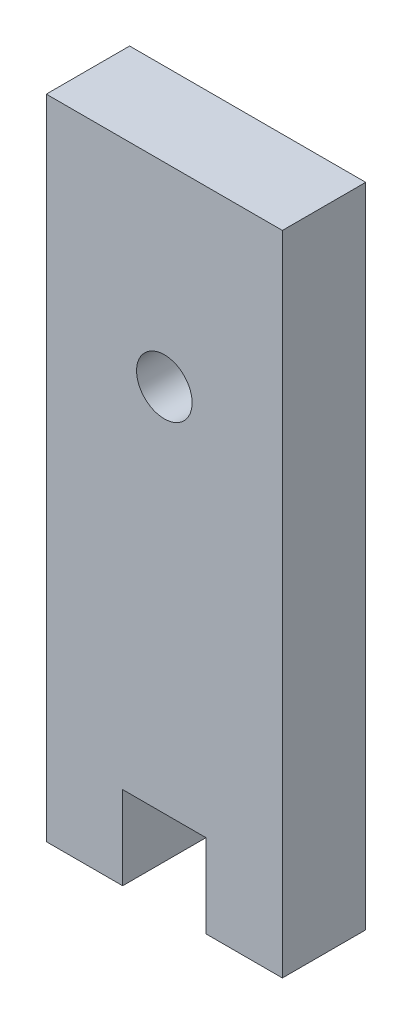
ISO-10303-21;
HEADER;
FILE_DESCRIPTION(('STEP AP214'),'2;1');
FILE_NAME('part.step','',(''),(''),'','','');
FILE_SCHEMA(('AUTOMOTIVE_DESIGN { 1 0 10303 214 1 1 1 1 }'));
ENDSEC;
DATA;
#1=APPLICATION_CONTEXT('core data for automotive mechanical design processes');
#2=APPLICATION_PROTOCOL_DEFINITION('international standard','automotive_design',2000,#1);
#3=PRODUCT_CONTEXT('',#1,'mechanical');
#4=PRODUCT('Part','Part','',(#3));
#5=PRODUCT_RELATED_PRODUCT_CATEGORY('part','',(#4));
#6=PRODUCT_DEFINITION_FORMATION('','',#4);
#7=PRODUCT_DEFINITION_CONTEXT('part definition',#1,'design');
#8=PRODUCT_DEFINITION('design','',#6,#7);
#9=PRODUCT_DEFINITION_SHAPE('','',#8);
#10=(LENGTH_UNIT() NAMED_UNIT(*) SI_UNIT(.MILLI.,.METRE.));
#11=(NAMED_UNIT(*) PLANE_ANGLE_UNIT() SI_UNIT($,.RADIAN.));
#12=(NAMED_UNIT(*) SI_UNIT($,.STERADIAN.) SOLID_ANGLE_UNIT());
#13=UNCERTAINTY_MEASURE_WITH_UNIT(LENGTH_MEASURE(1.E-05),#10,'distance_accuracy_value','');
#14=(GEOMETRIC_REPRESENTATION_CONTEXT(3) GLOBAL_UNCERTAINTY_ASSIGNED_CONTEXT((#13)) GLOBAL_UNIT_ASSIGNED_CONTEXT((#10,
#11,#12)) REPRESENTATION_CONTEXT('',''));
#15=CARTESIAN_POINT('',(0.,0.,0.));
#16=DIRECTION('',(0.,0.,1.));
#17=DIRECTION('',(1.,0.,0.));
#18=AXIS2_PLACEMENT_3D('',#15,#16,#17);
#19=CARTESIAN_POINT('',(0.,0.,3.));
#20=DIRECTION('',(0.,0.,-1.));
#21=DIRECTION('',(-1.,0.,0.));
#22=AXIS2_PLACEMENT_3D('',#19,#20,#21);
#23=PLANE('',#22);
#24=DIRECTION('',(0.,1.,0.));
#25=VECTOR('',#24,1.);
#26=CARTESIAN_POINT('',(6.07144018702043,-7.25278388972828,3.));
#27=LINE('',#26,#25);
#28=CARTESIAN_POINT('',(6.07144018702043,-10.2527838897283,3.));
#29=VERTEX_POINT('',#28);
#30=CARTESIAN_POINT('',(6.07144018702043,13.0563159058902,3.));
#31=VERTEX_POINT('',#30);
#32=EDGE_CURVE('E57',#29,#31,#27,.T.);
#33=ORIENTED_EDGE('',*,*,#32,.T.);
#34=DIRECTION('',(-1.,0.,0.));
#35=VECTOR('',#34,1.);
#36=CARTESIAN_POINT('',(-2.42855981297957,13.0563159058902,3.));
#37=LINE('',#36,#35);
#38=CARTESIAN_POINT('',(-2.42855981297957,13.0563159058902,3.));
#39=VERTEX_POINT('',#38);
#40=EDGE_CURVE('E101',#31,#39,#37,.T.);
#41=ORIENTED_EDGE('',*,*,#40,.T.);
#42=DIRECTION('',(0.,-1.,0.));
#43=VECTOR('',#42,1.);
#44=CARTESIAN_POINT('',(-2.42855981297957,-7.44368409410983,3.));
#45=LINE('',#44,#43);
#46=CARTESIAN_POINT('',(-2.42855981297957,-10.2527838897283,3.));
#47=VERTEX_POINT('',#46);
#48=EDGE_CURVE('E187',#39,#47,#45,.T.);
#49=ORIENTED_EDGE('',*,*,#48,.T.);
#50=DIRECTION('',(1.,0.,0.));
#51=VECTOR('',#50,1.);
#52=CARTESIAN_POINT('',(-2.42855981297957,-10.2527838897283,3.));
#53=LINE('',#52,#51);
#54=CARTESIAN_POINT('',(0.321440187020429,-10.2527838897283,3.));
#55=VERTEX_POINT('',#54);
#56=EDGE_CURVE('E202',#47,#55,#53,.T.);
#57=ORIENTED_EDGE('',*,*,#56,.T.);
#58=DIRECTION('',(0.,1.,0.));
#59=VECTOR('',#58,1.);
#60=CARTESIAN_POINT('',(0.321440187020429,-10.2527838897283,3.));
#61=LINE('',#60,#59);
#62=CARTESIAN_POINT('',(0.321440187020429,-7.25278388972828,3.));
#63=VERTEX_POINT('',#62);
#64=EDGE_CURVE('E121',#55,#63,#61,.T.);
#65=ORIENTED_EDGE('',*,*,#64,.T.);
#66=DIRECTION('',(1.,0.,0.));
#67=VECTOR('',#66,1.);
#68=CARTESIAN_POINT('',(0.321440187020429,-7.25278388972828,3.));
#69=LINE('',#68,#67);
#70=CARTESIAN_POINT('',(3.32144018702043,-7.25278388972828,3.));
#71=VERTEX_POINT('',#70);
#72=EDGE_CURVE('E115',#63,#71,#69,.T.);
#73=ORIENTED_EDGE('',*,*,#72,.T.);
#74=DIRECTION('',(0.,-1.,0.));
#75=VECTOR('',#74,1.);
#76=CARTESIAN_POINT('',(3.32144018702043,-10.2527838897283,3.));
#77=LINE('',#76,#75);
#78=CARTESIAN_POINT('',(3.32144018702043,-10.2527838897283,3.));
#79=VERTEX_POINT('',#78);
#80=EDGE_CURVE('E119',#71,#79,#77,.T.);
#81=ORIENTED_EDGE('',*,*,#80,.T.);
#82=DIRECTION('',(1.,0.,0.));
#83=VECTOR('',#82,1.);
#84=CARTESIAN_POINT('',(3.32144018702043,-10.2527838897283,3.));
#85=LINE('',#84,#83);
#86=EDGE_CURVE('E138',#79,#29,#85,.T.);
#87=ORIENTED_EDGE('',*,*,#86,.T.);
#88=EDGE_LOOP('',(#33,#41,#49,#57,#65,#73,#81,#87));
#89=FACE_BOUND('',#88,.T.);
#90=CARTESIAN_POINT('',(1.82144018702043,6.05631590589017,3.));
#91=DIRECTION('',(0.,0.,1.));
#92=DIRECTION('',(1.,0.,0.));
#93=AXIS2_PLACEMENT_3D('',#90,#91,#92);
#94=CIRCLE('',#93,1.);
#95=CARTESIAN_POINT('',(2.82144018702043,6.05631590589017,3.));
#96=VERTEX_POINT('',#95);
#97=EDGE_CURVE('E150',#96,#96,#94,.T.);
#98=ORIENTED_EDGE('',*,*,#97,.F.);
#99=EDGE_LOOP('',(#98));
#100=FACE_BOUND('',#99,.T.);
#101=ADVANCED_FACE('F39',(#89,#100),#23,.F.);
#102=CARTESIAN_POINT('',(0.,0.,0.));
#103=DIRECTION('',(0.,0.,-1.));
#104=DIRECTION('',(-1.,0.,0.));
#105=AXIS2_PLACEMENT_3D('',#102,#103,#104);
#106=PLANE('',#105);
#107=DIRECTION('',(-1.,0.,0.));
#108=VECTOR('',#107,1.);
#109=CARTESIAN_POINT('',(-2.42855981297957,13.0563159058902,0.));
#110=LINE('',#109,#108);
#111=CARTESIAN_POINT('',(6.07144018702043,13.0563159058902,0.));
#112=VERTEX_POINT('',#111);
#113=CARTESIAN_POINT('',(-2.42855981297957,13.0563159058902,0.));
#114=VERTEX_POINT('',#113);
#115=EDGE_CURVE('E145',#112,#114,#110,.T.);
#116=ORIENTED_EDGE('',*,*,#115,.F.);
#117=DIRECTION('',(0.,1.,0.));
#118=VECTOR('',#117,1.);
#119=CARTESIAN_POINT('',(6.07144018702043,-7.25278388972828,0.));
#120=LINE('',#119,#118);
#121=CARTESIAN_POINT('',(6.07144018702043,-10.2527838897283,0.));
#122=VERTEX_POINT('',#121);
#123=EDGE_CURVE('E165',#122,#112,#120,.T.);
#124=ORIENTED_EDGE('',*,*,#123,.F.);
#125=DIRECTION('',(1.,0.,0.));
#126=VECTOR('',#125,1.);
#127=CARTESIAN_POINT('',(3.32144018702043,-10.2527838897283,0.));
#128=LINE('',#127,#126);
#129=CARTESIAN_POINT('',(3.32144018702043,-10.2527838897283,0.));
#130=VERTEX_POINT('',#129);
#131=EDGE_CURVE('E94',#130,#122,#128,.T.);
#132=ORIENTED_EDGE('',*,*,#131,.F.);
#133=DIRECTION('',(0.,-1.,0.));
#134=VECTOR('',#133,1.);
#135=CARTESIAN_POINT('',(3.32144018702043,-10.2527838897283,0.));
#136=LINE('',#135,#134);
#137=CARTESIAN_POINT('',(3.32144018702043,-7.25278388972828,0.));
#138=VERTEX_POINT('',#137);
#139=EDGE_CURVE('E87',#138,#130,#136,.T.);
#140=ORIENTED_EDGE('',*,*,#139,.F.);
#141=DIRECTION('',(1.,0.,0.));
#142=VECTOR('',#141,1.);
#143=CARTESIAN_POINT('',(0.321440187020429,-7.25278388972828,0.));
#144=LINE('',#143,#142);
#145=CARTESIAN_POINT('',(0.321440187020429,-7.25278388972828,0.));
#146=VERTEX_POINT('',#145);
#147=EDGE_CURVE('E130',#146,#138,#144,.T.);
#148=ORIENTED_EDGE('',*,*,#147,.F.);
#149=DIRECTION('',(0.,1.,0.));
#150=VECTOR('',#149,1.);
#151=CARTESIAN_POINT('',(0.321440187020429,-10.2527838897283,0.));
#152=LINE('',#151,#150);
#153=CARTESIAN_POINT('',(0.321440187020429,-10.2527838897283,0.));
#154=VERTEX_POINT('',#153);
#155=EDGE_CURVE('E156',#154,#146,#152,.T.);
#156=ORIENTED_EDGE('',*,*,#155,.F.);
#157=DIRECTION('',(1.,0.,0.));
#158=VECTOR('',#157,1.);
#159=CARTESIAN_POINT('',(-2.42855981297957,-10.2527838897283,0.));
#160=LINE('',#159,#158);
#161=CARTESIAN_POINT('',(-2.42855981297957,-10.2527838897283,0.));
#162=VERTEX_POINT('',#161);
#163=EDGE_CURVE('E153',#162,#154,#160,.T.);
#164=ORIENTED_EDGE('',*,*,#163,.F.);
#165=DIRECTION('',(0.,-1.,0.));
#166=VECTOR('',#165,1.);
#167=CARTESIAN_POINT('',(-2.42855981297957,-7.44368409410983,0.));
#168=LINE('',#167,#166);
#169=EDGE_CURVE('E149',#114,#162,#168,.T.);
#170=ORIENTED_EDGE('',*,*,#169,.F.);
#171=EDGE_LOOP('',(#116,#124,#132,#140,#148,#156,#164,#170));
#172=FACE_BOUND('',#171,.T.);
#173=CARTESIAN_POINT('',(1.82144018702043,6.05631590589017,0.));
#174=DIRECTION('',(0.,0.,1.));
#175=DIRECTION('',(1.,0.,0.));
#176=AXIS2_PLACEMENT_3D('',#173,#174,#175);
#177=CIRCLE('',#176,1.);
#178=CARTESIAN_POINT('',(2.82144018702043,6.05631590589017,0.));
#179=VERTEX_POINT('',#178);
#180=EDGE_CURVE('E212',#179,#179,#177,.T.);
#181=ORIENTED_EDGE('',*,*,#180,.T.);
#182=EDGE_LOOP('',(#181));
#183=FACE_BOUND('',#182,.T.);
#184=ADVANCED_FACE('F191',(#172,#183),#106,.T.);
#185=CARTESIAN_POINT('',(-2.42855981297957,13.0563159058902,3.));
#186=DIRECTION('',(0.,-1.,0.));
#187=DIRECTION('',(0.,0.,-1.));
#188=AXIS2_PLACEMENT_3D('',#185,#186,#187);
#189=PLANE('',#188);
#190=ORIENTED_EDGE('',*,*,#115,.T.);
#191=DIRECTION('',(0.,0.,-1.));
#192=VECTOR('',#191,1.);
#193=CARTESIAN_POINT('',(-2.42855981297957,13.0563159058902,3.));
#194=LINE('',#193,#192);
#195=EDGE_CURVE('E49',#39,#114,#194,.T.);
#196=ORIENTED_EDGE('',*,*,#195,.F.);
#197=ORIENTED_EDGE('',*,*,#40,.F.);
#198=DIRECTION('',(0.,0.,-1.));
#199=VECTOR('',#198,1.);
#200=CARTESIAN_POINT('',(6.07144018702043,13.0563159058902,3.));
#201=LINE('',#200,#199);
#202=EDGE_CURVE('E11',#31,#112,#201,.T.);
#203=ORIENTED_EDGE('',*,*,#202,.T.);
#204=EDGE_LOOP('',(#190,#196,#197,#203));
#205=FACE_BOUND('',#204,.T.);
#206=ADVANCED_FACE('F41',(#205),#189,.F.);
#207=CARTESIAN_POINT('',(-2.42855981297957,-7.44368409410983,3.));
#208=DIRECTION('',(1.,0.,0.));
#209=DIRECTION('',(0.,1.,0.));
#210=AXIS2_PLACEMENT_3D('',#207,#208,#209);
#211=PLANE('',#210);
#212=ORIENTED_EDGE('',*,*,#169,.T.);
#213=DIRECTION('',(0.,0.,-1.));
#214=VECTOR('',#213,1.);
#215=CARTESIAN_POINT('',(-2.42855981297957,-10.2527838897283,3.));
#216=LINE('',#215,#214);
#217=EDGE_CURVE('E178',#47,#162,#216,.T.);
#218=ORIENTED_EDGE('',*,*,#217,.F.);
#219=ORIENTED_EDGE('',*,*,#48,.F.);
#220=ORIENTED_EDGE('',*,*,#195,.T.);
#221=EDGE_LOOP('',(#212,#218,#219,#220));
#222=FACE_BOUND('',#221,.T.);
#223=ADVANCED_FACE('F185',(#222),#211,.F.);
#224=CARTESIAN_POINT('',(-2.42855981297957,-10.2527838897283,3.));
#225=DIRECTION('',(0.,1.,0.));
#226=DIRECTION('',(-1.,0.,0.));
#227=AXIS2_PLACEMENT_3D('',#224,#225,#226);
#228=PLANE('',#227);
#229=ORIENTED_EDGE('',*,*,#163,.T.);
#230=DIRECTION('',(0.,0.,-1.));
#231=VECTOR('',#230,1.);
#232=CARTESIAN_POINT('',(0.321440187020429,-10.2527838897283,3.));
#233=LINE('',#232,#231);
#234=EDGE_CURVE('E174',#55,#154,#233,.T.);
#235=ORIENTED_EDGE('',*,*,#234,.F.);
#236=ORIENTED_EDGE('',*,*,#56,.F.);
#237=ORIENTED_EDGE('',*,*,#217,.T.);
#238=EDGE_LOOP('',(#229,#235,#236,#237));
#239=FACE_BOUND('',#238,.T.);
#240=ADVANCED_FACE('F197',(#239),#228,.F.);
#241=CARTESIAN_POINT('',(0.321440187020429,-10.2527838897283,3.));
#242=DIRECTION('',(-1.,0.,0.));
#243=DIRECTION('',(0.,-1.,0.));
#244=AXIS2_PLACEMENT_3D('',#241,#242,#243);
#245=PLANE('',#244);
#246=ORIENTED_EDGE('',*,*,#155,.T.);
#247=DIRECTION('',(0.,0.,-1.));
#248=VECTOR('',#247,1.);
#249=CARTESIAN_POINT('',(0.321440187020429,-7.25278388972828,3.));
#250=LINE('',#249,#248);
#251=EDGE_CURVE('E132',#63,#146,#250,.T.);
#252=ORIENTED_EDGE('',*,*,#251,.F.);
#253=ORIENTED_EDGE('',*,*,#64,.F.);
#254=ORIENTED_EDGE('',*,*,#234,.T.);
#255=EDGE_LOOP('',(#246,#252,#253,#254));
#256=FACE_BOUND('',#255,.T.);
#257=ADVANCED_FACE('F200',(#256),#245,.F.);
#258=CARTESIAN_POINT('',(0.321440187020429,-7.25278388972828,3.));
#259=DIRECTION('',(0.,1.,0.));
#260=DIRECTION('',(0.,0.,1.));
#261=AXIS2_PLACEMENT_3D('',#258,#259,#260);
#262=PLANE('',#261);
#263=ORIENTED_EDGE('',*,*,#147,.T.);
#264=DIRECTION('',(0.,0.,-1.));
#265=VECTOR('',#264,1.);
#266=CARTESIAN_POINT('',(3.32144018702043,-7.25278388972828,3.));
#267=LINE('',#266,#265);
#268=EDGE_CURVE('E127',#71,#138,#267,.T.);
#269=ORIENTED_EDGE('',*,*,#268,.F.);
#270=ORIENTED_EDGE('',*,*,#72,.F.);
#271=ORIENTED_EDGE('',*,*,#251,.T.);
#272=EDGE_LOOP('',(#263,#269,#270,#271));
#273=FACE_BOUND('',#272,.T.);
#274=ADVANCED_FACE('F128',(#273),#262,.F.);
#275=CARTESIAN_POINT('',(3.32144018702043,-10.2527838897283,3.));
#276=DIRECTION('',(1.,0.,0.));
#277=DIRECTION('',(0.,0.,-1.));
#278=AXIS2_PLACEMENT_3D('',#275,#276,#277);
#279=PLANE('',#278);
#280=ORIENTED_EDGE('',*,*,#139,.T.);
#281=DIRECTION('',(0.,0.,-1.));
#282=VECTOR('',#281,1.);
#283=CARTESIAN_POINT('',(3.32144018702043,-10.2527838897283,3.));
#284=LINE('',#283,#282);
#285=EDGE_CURVE('E133',#79,#130,#284,.T.);
#286=ORIENTED_EDGE('',*,*,#285,.F.);
#287=ORIENTED_EDGE('',*,*,#80,.F.);
#288=ORIENTED_EDGE('',*,*,#268,.T.);
#289=EDGE_LOOP('',(#280,#286,#287,#288));
#290=FACE_BOUND('',#289,.T.);
#291=ADVANCED_FACE('F135',(#290),#279,.F.);
#292=CARTESIAN_POINT('',(3.32144018702043,-10.2527838897283,3.));
#293=DIRECTION('',(0.,1.,0.));
#294=DIRECTION('',(0.,0.,1.));
#295=AXIS2_PLACEMENT_3D('',#292,#293,#294);
#296=PLANE('',#295);
#297=ORIENTED_EDGE('',*,*,#131,.T.);
#298=DIRECTION('',(0.,0.,-1.));
#299=VECTOR('',#298,1.);
#300=CARTESIAN_POINT('',(6.07144018702043,-10.2527838897283,3.));
#301=LINE('',#300,#299);
#302=EDGE_CURVE('E141',#29,#122,#301,.T.);
#303=ORIENTED_EDGE('',*,*,#302,.F.);
#304=ORIENTED_EDGE('',*,*,#86,.F.);
#305=ORIENTED_EDGE('',*,*,#285,.T.);
#306=EDGE_LOOP('',(#297,#303,#304,#305));
#307=FACE_BOUND('',#306,.T.);
#308=ADVANCED_FACE('F233',(#307),#296,.F.);
#309=CARTESIAN_POINT('',(6.07144018702043,-7.25278388972828,3.));
#310=DIRECTION('',(-1.,0.,0.));
#311=DIRECTION('',(0.,-1.,0.));
#312=AXIS2_PLACEMENT_3D('',#309,#310,#311);
#313=PLANE('',#312);
#314=ORIENTED_EDGE('',*,*,#123,.T.);
#315=ORIENTED_EDGE('',*,*,#202,.F.);
#316=ORIENTED_EDGE('',*,*,#32,.F.);
#317=ORIENTED_EDGE('',*,*,#302,.T.);
#318=EDGE_LOOP('',(#314,#315,#316,#317));
#319=FACE_BOUND('',#318,.T.);
#320=ADVANCED_FACE('F230',(#319),#313,.F.);
#321=CARTESIAN_POINT('',(1.82144018702043,6.05631590589017,3.));
#322=DIRECTION('',(0.,0.,-1.));
#323=DIRECTION('',(-1.,0.,0.));
#324=AXIS2_PLACEMENT_3D('',#321,#322,#323);
#325=CYLINDRICAL_SURFACE('',#324,1.);
#326=ORIENTED_EDGE('',*,*,#97,.T.);
#327=EDGE_LOOP('',(#326));
#328=FACE_BOUND('',#327,.T.);
#329=ORIENTED_EDGE('',*,*,#180,.F.);
#330=EDGE_LOOP('',(#329));
#331=FACE_BOUND('',#330,.T.);
#332=ADVANCED_FACE('F220',(#328,#331),#325,.F.);
#333=CLOSED_SHELL('',(#101,#184,#206,#223,#240,#257,#274,#291,#308,#320,#332));
#334=MANIFOLD_SOLID_BREP('B2',#333);
#335=ADVANCED_BREP_SHAPE_REPRESENTATION('',(#18,#334),#14);
#336=SHAPE_DEFINITION_REPRESENTATION(#9,#335);
ENDSEC;
END-ISO-10303-21;
